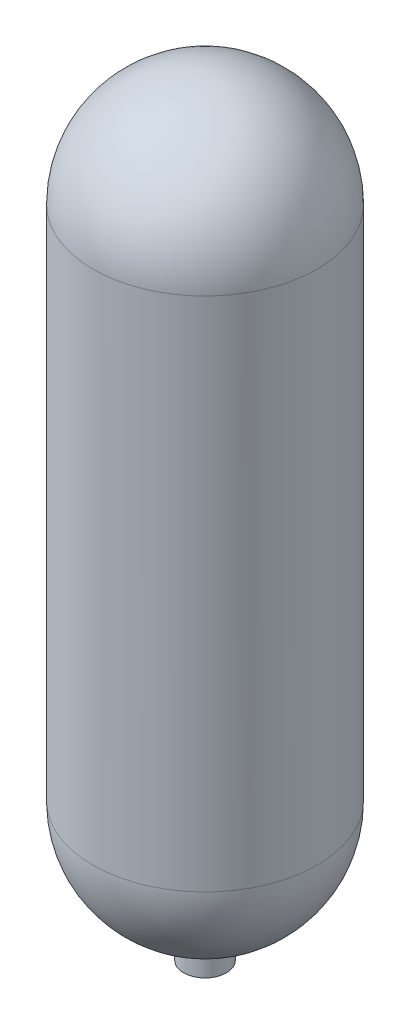
ISO-10303-21;
HEADER;
FILE_DESCRIPTION(('STEP AP214'),'2;1');
FILE_NAME('part.step','',(''),(''),'','','');
FILE_SCHEMA(('AUTOMOTIVE_DESIGN { 1 0 10303 214 1 1 1 1 }'));
ENDSEC;
DATA;
#1=APPLICATION_CONTEXT('core data for automotive mechanical design processes');
#2=APPLICATION_PROTOCOL_DEFINITION('international standard','automotive_design',2000,#1);
#3=PRODUCT_CONTEXT('',#1,'mechanical');
#4=PRODUCT('Part','Part','',(#3));
#5=PRODUCT_RELATED_PRODUCT_CATEGORY('part','',(#4));
#6=PRODUCT_DEFINITION_FORMATION('','',#4);
#7=PRODUCT_DEFINITION_CONTEXT('part definition',#1,'design');
#8=PRODUCT_DEFINITION('design','',#6,#7);
#9=PRODUCT_DEFINITION_SHAPE('','',#8);
#10=(LENGTH_UNIT() NAMED_UNIT(*) SI_UNIT(.MILLI.,.METRE.));
#11=(NAMED_UNIT(*) PLANE_ANGLE_UNIT() SI_UNIT($,.RADIAN.));
#12=(NAMED_UNIT(*) SI_UNIT($,.STERADIAN.) SOLID_ANGLE_UNIT());
#13=UNCERTAINTY_MEASURE_WITH_UNIT(LENGTH_MEASURE(1.E-05),#10,'distance_accuracy_value','');
#14=(GEOMETRIC_REPRESENTATION_CONTEXT(3) GLOBAL_UNCERTAINTY_ASSIGNED_CONTEXT((#13)) GLOBAL_UNIT_ASSIGNED_CONTEXT((#10,
#11,#12)) REPRESENTATION_CONTEXT('',''));
#15=CARTESIAN_POINT('',(0.,0.,0.));
#16=DIRECTION('',(0.,0.,1.));
#17=DIRECTION('',(1.,0.,0.));
#18=AXIS2_PLACEMENT_3D('',#15,#16,#17);
#19=CARTESIAN_POINT('',(0.,0.,0.));
#20=DIRECTION('',(0.,-1.,0.));
#21=DIRECTION('',(0.,0.,-1.));
#22=AXIS2_PLACEMENT_3D('',#19,#20,#21);
#23=PLANE('',#22);
#24=CARTESIAN_POINT('',(0.,0.,0.));
#25=DIRECTION('',(0.,-1.,0.));
#26=DIRECTION('',(0.,0.,-1.));
#27=AXIS2_PLACEMENT_3D('',#24,#25,#26);
#28=CIRCLE('',#27,8.24999999999999);
#29=CARTESIAN_POINT('',(0.,0.,-8.24999999999999));
#30=VERTEX_POINT('',#29);
#31=EDGE_CURVE('E57',#30,#30,#28,.T.);
#32=ORIENTED_EDGE('',*,*,#31,.F.);
#33=EDGE_LOOP('',(#32));
#34=FACE_BOUND('',#33,.T.);
#35=CARTESIAN_POINT('',(0.,0.,0.));
#36=DIRECTION('',(0.,-1.,0.));
#37=DIRECTION('',(0.,0.,-1.));
#38=AXIS2_PLACEMENT_3D('',#35,#36,#37);
#39=CIRCLE('',#38,15.);
#40=CARTESIAN_POINT('',(0.,0.,-15.));
#41=VERTEX_POINT('',#40);
#42=EDGE_CURVE('E45',#41,#41,#39,.T.);
#43=ORIENTED_EDGE('',*,*,#42,.T.);
#44=EDGE_LOOP('',(#43));
#45=FACE_BOUND('',#44,.T.);
#46=ADVANCED_FACE('F34',(#34,#45),#23,.T.);
#47=CARTESIAN_POINT('',(0.,0.,0.));
#48=DIRECTION('',(0.,-1.,0.));
#49=DIRECTION('',(0.,0.,-1.));
#50=AXIS2_PLACEMENT_3D('',#47,#48,#49);
#51=CYLINDRICAL_SURFACE('',#50,15.);
#52=CARTESIAN_POINT('',(0.,15.9841381045946,0.));
#53=DIRECTION('',(0.,1.,0.));
#54=DIRECTION('',(0.,0.,1.));
#55=AXIS2_PLACEMENT_3D('',#52,#53,#54);
#56=CIRCLE('',#55,15.);
#57=CARTESIAN_POINT('',(0.,15.9841381045946,15.));
#58=VERTEX_POINT('',#57);
#59=EDGE_CURVE('E41',#58,#58,#56,.F.);
#60=ORIENTED_EDGE('',*,*,#59,.T.);
#61=EDGE_LOOP('',(#60));
#62=FACE_BOUND('',#61,.T.);
#63=ORIENTED_EDGE('',*,*,#42,.F.);
#64=EDGE_LOOP('',(#63));
#65=FACE_BOUND('',#64,.T.);
#66=ADVANCED_FACE('F107',(#62,#65),#51,.T.);
#67=CARTESIAN_POINT('',(0.,97.0535528058247,0.));
#68=DIRECTION('',(0.,-1.,0.));
#69=DIRECTION('',(1.,0.,0.));
#70=AXIS2_PLACEMENT_3D('',#67,#68,#69);
#71=SPHERICAL_SURFACE('',#70,78.5);
#72=CARTESIAN_POINT('',(0.,20.8385940747282,0.));
#73=DIRECTION('',(0.,1.,0.));
#74=DIRECTION('',(0.,0.,1.));
#75=AXIS2_PLACEMENT_3D('',#72,#73,#74);
#76=CIRCLE('',#75,18.8023952095808);
#77=CARTESIAN_POINT('',(0.,20.8385940747282,18.8023952095808));
#78=VERTEX_POINT('',#77);
#79=EDGE_CURVE('E10',#78,#78,#76,.T.);
#80=ORIENTED_EDGE('',*,*,#79,.T.);
#81=EDGE_LOOP('',(#80));
#82=FACE_BOUND('',#81,.T.);
#83=CARTESIAN_POINT('',(0.,97.0535528058247,0.));
#84=DIRECTION('',(0.,-1.,0.));
#85=DIRECTION('',(0.,0.,-1.));
#86=AXIS2_PLACEMENT_3D('',#83,#84,#85);
#87=CIRCLE('',#86,78.5000000000001);
#88=CARTESIAN_POINT('',(0.,97.0535528058247,-78.5000000000001));
#89=VERTEX_POINT('',#88);
#90=EDGE_CURVE('E49',#89,#89,#87,.T.);
#91=ORIENTED_EDGE('',*,*,#90,.T.);
#92=EDGE_LOOP('',(#91));
#93=FACE_BOUND('',#92,.T.);
#94=ADVANCED_FACE('F112',(#82,#93),#71,.T.);
#95=CARTESIAN_POINT('',(0.,0.,0.));
#96=DIRECTION('',(0.,-1.,0.));
#97=DIRECTION('',(0.,0.,-1.));
#98=AXIS2_PLACEMENT_3D('',#95,#96,#97);
#99=CYLINDRICAL_SURFACE('',#98,78.5);
#100=CARTESIAN_POINT('',(0.,458.5,0.));
#101=DIRECTION('',(0.,-1.,0.));
#102=DIRECTION('',(0.,0.,-1.));
#103=AXIS2_PLACEMENT_3D('',#100,#101,#102);
#104=CIRCLE('',#103,78.5);
#105=CARTESIAN_POINT('',(0.,458.5,-78.5));
#106=VERTEX_POINT('',#105);
#107=EDGE_CURVE('E54',#106,#106,#104,.T.);
#108=ORIENTED_EDGE('',*,*,#107,.T.);
#109=EDGE_LOOP('',(#108));
#110=FACE_BOUND('',#109,.T.);
#111=ORIENTED_EDGE('',*,*,#90,.F.);
#112=EDGE_LOOP('',(#111));
#113=FACE_BOUND('',#112,.T.);
#114=ADVANCED_FACE('F103',(#110,#113),#99,.T.);
#115=CARTESIAN_POINT('',(0.,458.5,0.));
#116=DIRECTION('',(0.,-1.,0.));
#117=DIRECTION('',(1.,0.,0.));
#118=AXIS2_PLACEMENT_3D('',#115,#116,#117);
#119=SPHERICAL_SURFACE('',#118,78.5);
#120=ORIENTED_EDGE('',*,*,#107,.F.);
#121=EDGE_LOOP('',(#120));
#122=FACE_BOUND('',#121,.T.);
#123=ADVANCED_FACE('F95',(#122),#119,.T.);
#124=CARTESIAN_POINT('',(0.,0.,0.));
#125=DIRECTION('',(0.,-1.,0.));
#126=DIRECTION('',(0.,0.,-1.));
#127=AXIS2_PLACEMENT_3D('',#124,#125,#126);
#128=CYLINDRICAL_SURFACE('',#127,8.24999999999999);
#129=ORIENTED_EDGE('',*,*,#31,.T.);
#130=EDGE_LOOP('',(#129));
#131=FACE_BOUND('',#130,.T.);
#132=CARTESIAN_POINT('',(0.,25.6930500448617,0.));
#133=DIRECTION('',(0.,-1.,0.));
#134=DIRECTION('',(0.,0.,-1.));
#135=AXIS2_PLACEMENT_3D('',#132,#133,#134);
#136=CIRCLE('',#135,8.24999999999999);
#137=CARTESIAN_POINT('',(0.,25.6930500448617,-8.24999999999999));
#138=VERTEX_POINT('',#137);
#139=EDGE_CURVE('E60',#138,#138,#136,.T.);
#140=ORIENTED_EDGE('',*,*,#139,.F.);
#141=EDGE_LOOP('',(#140));
#142=FACE_BOUND('',#141,.T.);
#143=ADVANCED_FACE('F93',(#131,#142),#128,.F.);
#144=CARTESIAN_POINT('',(0.,15.9841381045946,0.));
#145=DIRECTION('',(0.,1.,0.));
#146=DIRECTION('',(0.,0.,1.));
#147=AXIS2_PLACEMENT_3D('',#144,#145,#146);
#148=TOROIDAL_SURFACE('',#147,20.,5.);
#149=ORIENTED_EDGE('',*,*,#79,.F.);
#150=EDGE_LOOP('',(#149));
#151=FACE_BOUND('',#150,.T.);
#152=ORIENTED_EDGE('',*,*,#59,.F.);
#153=EDGE_LOOP('',(#152));
#154=FACE_BOUND('',#153,.T.);
#155=ADVANCED_FACE('F36',(#151,#154),#148,.F.);
#156=CARTESIAN_POINT('',(8.24999999999999,25.6930500448617,0.));
#157=DIRECTION('',(0.,-1.,0.));
#158=DIRECTION('',(0.,0.,-1.));
#159=AXIS2_PLACEMENT_3D('',#156,#157,#158);
#160=PLANE('',#159);
#161=CARTESIAN_POINT('',(0.,25.6930500448617,0.));
#162=DIRECTION('',(0.,-1.,0.));
#163=DIRECTION('',(0.,0.,-1.));
#164=AXIS2_PLACEMENT_3D('',#161,#162,#163);
#165=CIRCLE('',#164,17.6047904191617);
#166=CARTESIAN_POINT('',(0.,25.6930500448617,-17.6047904191617));
#167=VERTEX_POINT('',#166);
#168=EDGE_CURVE('E63',#167,#167,#165,.T.);
#169=ORIENTED_EDGE('',*,*,#168,.F.);
#170=EDGE_LOOP('',(#169));
#171=FACE_BOUND('',#170,.T.);
#172=ORIENTED_EDGE('',*,*,#139,.T.);
#173=EDGE_LOOP('',(#172));
#174=FACE_BOUND('',#173,.T.);
#175=ADVANCED_FACE('F84',(#171,#174),#160,.F.);
#176=CARTESIAN_POINT('',(0.,97.0535528058247,0.));
#177=DIRECTION('',(0.,-1.,0.));
#178=DIRECTION('',(1.,0.,0.));
#179=AXIS2_PLACEMENT_3D('',#176,#177,#178);
#180=SPHERICAL_SURFACE('',#179,73.5);
#181=CARTESIAN_POINT('',(0.,97.0535528058247,0.));
#182=DIRECTION('',(0.,-1.,0.));
#183=DIRECTION('',(0.,0.,-1.));
#184=AXIS2_PLACEMENT_3D('',#181,#182,#183);
#185=CIRCLE('',#184,73.5);
#186=CARTESIAN_POINT('',(0.,97.0535528058247,-73.5));
#187=VERTEX_POINT('',#186);
#188=EDGE_CURVE('E66',#187,#187,#185,.T.);
#189=ORIENTED_EDGE('',*,*,#188,.F.);
#190=EDGE_LOOP('',(#189));
#191=FACE_BOUND('',#190,.T.);
#192=ORIENTED_EDGE('',*,*,#168,.T.);
#193=EDGE_LOOP('',(#192));
#194=FACE_BOUND('',#193,.T.);
#195=ADVANCED_FACE('F78',(#191,#194),#180,.F.);
#196=CARTESIAN_POINT('',(0.,0.,0.));
#197=DIRECTION('',(0.,-1.,0.));
#198=DIRECTION('',(0.,0.,-1.));
#199=AXIS2_PLACEMENT_3D('',#196,#197,#198);
#200=CYLINDRICAL_SURFACE('',#199,73.5);
#201=CARTESIAN_POINT('',(0.,458.5,0.));
#202=DIRECTION('',(0.,-1.,0.));
#203=DIRECTION('',(0.,0.,-1.));
#204=AXIS2_PLACEMENT_3D('',#201,#202,#203);
#205=CIRCLE('',#204,73.5000000000001);
#206=CARTESIAN_POINT('',(0.,458.5,-73.5000000000001));
#207=VERTEX_POINT('',#206);
#208=EDGE_CURVE('E69',#207,#207,#205,.T.);
#209=ORIENTED_EDGE('',*,*,#208,.F.);
#210=EDGE_LOOP('',(#209));
#211=FACE_BOUND('',#210,.T.);
#212=ORIENTED_EDGE('',*,*,#188,.T.);
#213=EDGE_LOOP('',(#212));
#214=FACE_BOUND('',#213,.T.);
#215=ADVANCED_FACE('F75',(#211,#214),#200,.F.);
#216=CARTESIAN_POINT('',(0.,458.5,0.));
#217=DIRECTION('',(0.,-1.,0.));
#218=DIRECTION('',(1.,0.,0.));
#219=AXIS2_PLACEMENT_3D('',#216,#217,#218);
#220=SPHERICAL_SURFACE('',#219,73.5);
#221=ORIENTED_EDGE('',*,*,#208,.T.);
#222=EDGE_LOOP('',(#221));
#223=FACE_BOUND('',#222,.T.);
#224=ADVANCED_FACE('F73',(#223),#220,.F.);
#225=CLOSED_SHELL('',(#46,#66,#94,#114,#123,#143,#155,#175,#195,#215,#224));
#226=MANIFOLD_SOLID_BREP('B2',#225);
#227=ADVANCED_BREP_SHAPE_REPRESENTATION('',(#18,#226),#14);
#228=SHAPE_DEFINITION_REPRESENTATION(#9,#227);
ENDSEC;
END-ISO-10303-21;
